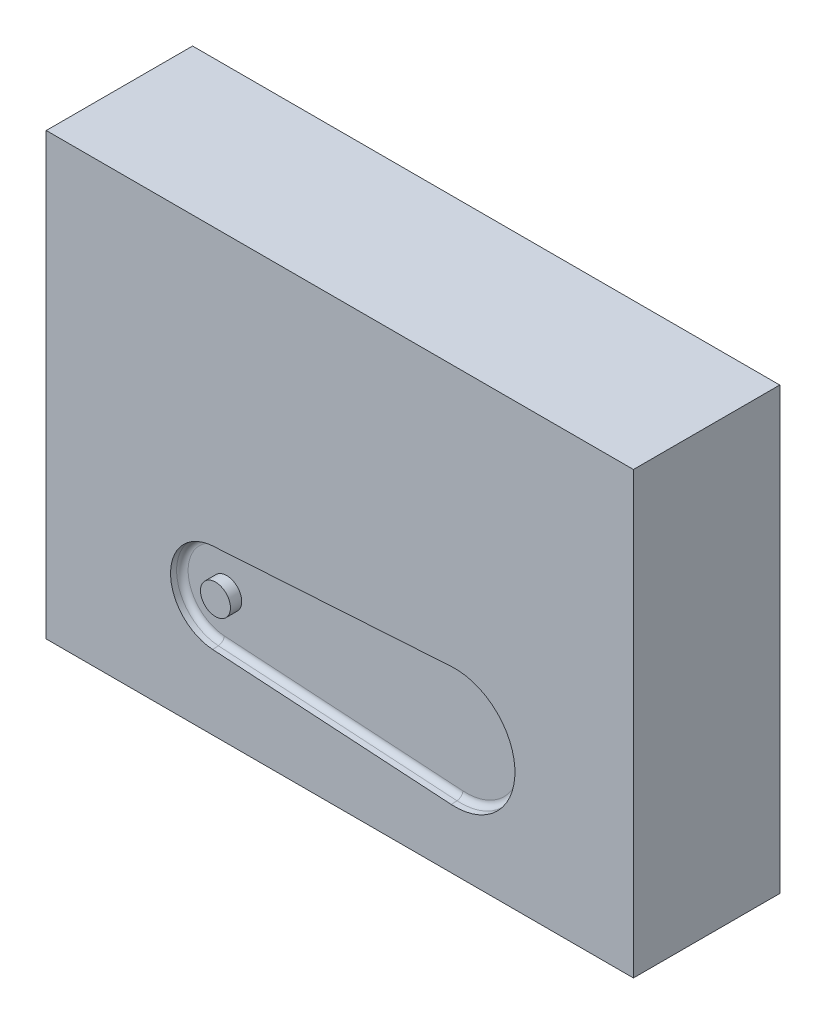
ISO-10303-21;
HEADER;
FILE_DESCRIPTION(('STEP AP214'),'2;1');
FILE_NAME('part.step','',(''),(''),'','','');
FILE_SCHEMA(('AUTOMOTIVE_DESIGN { 1 0 10303 214 1 1 1 1 }'));
ENDSEC;
DATA;
#1=APPLICATION_CONTEXT('core data for automotive mechanical design processes');
#2=APPLICATION_PROTOCOL_DEFINITION('international standard','automotive_design',2000,#1);
#3=PRODUCT_CONTEXT('',#1,'mechanical');
#4=PRODUCT('Part','Part','',(#3));
#5=PRODUCT_RELATED_PRODUCT_CATEGORY('part','',(#4));
#6=PRODUCT_DEFINITION_FORMATION('','',#4);
#7=PRODUCT_DEFINITION_CONTEXT('part definition',#1,'design');
#8=PRODUCT_DEFINITION('design','',#6,#7);
#9=PRODUCT_DEFINITION_SHAPE('','',#8);
#10=(LENGTH_UNIT() NAMED_UNIT(*) SI_UNIT(.MILLI.,.METRE.));
#11=(NAMED_UNIT(*) PLANE_ANGLE_UNIT() SI_UNIT($,.RADIAN.));
#12=(NAMED_UNIT(*) SI_UNIT($,.STERADIAN.) SOLID_ANGLE_UNIT());
#13=UNCERTAINTY_MEASURE_WITH_UNIT(LENGTH_MEASURE(1.E-05),#10,'distance_accuracy_value','');
#14=(GEOMETRIC_REPRESENTATION_CONTEXT(3) GLOBAL_UNCERTAINTY_ASSIGNED_CONTEXT((#13)) GLOBAL_UNIT_ASSIGNED_CONTEXT((#10,
#11,#12)) REPRESENTATION_CONTEXT('',''));
#15=CARTESIAN_POINT('',(0.,0.,0.));
#16=DIRECTION('',(0.,0.,1.));
#17=DIRECTION('',(1.,0.,0.));
#18=AXIS2_PLACEMENT_3D('',#15,#16,#17);
#19=CARTESIAN_POINT('',(-79.9352750809062,56.6343042071197,100.));
#20=DIRECTION('',(1.,0.,0.));
#21=DIRECTION('',(0.,0.,-1.));
#22=AXIS2_PLACEMENT_3D('',#19,#20,#21);
#23=PLANE('',#22);
#24=DIRECTION('',(0.,-1.,0.));
#25=VECTOR('',#24,1.);
#26=CARTESIAN_POINT('',(-79.9352750809062,56.6343042071197,49.8415382280655));
#27=LINE('',#26,#25);
#28=CARTESIAN_POINT('',(-79.9352750809062,56.6343042071197,49.8415382280655));
#29=VERTEX_POINT('',#28);
#30=CARTESIAN_POINT('',(-79.9352750809062,-93.3656957928802,49.8415382280655));
#31=VERTEX_POINT('',#30);
#32=EDGE_CURVE('E128',#29,#31,#27,.T.);
#33=ORIENTED_EDGE('',*,*,#32,.F.);
#34=DIRECTION('',(0.,0.,-1.));
#35=VECTOR('',#34,1.);
#36=CARTESIAN_POINT('',(-79.9352750809062,56.6343042071197,100.));
#37=LINE('',#36,#35);
#38=CARTESIAN_POINT('',(-79.9352750809062,56.6343042071197,0.));
#39=VERTEX_POINT('',#38);
#40=EDGE_CURVE('E114',#29,#39,#37,.T.);
#41=ORIENTED_EDGE('',*,*,#40,.T.);
#42=DIRECTION('',(0.,-1.,0.));
#43=VECTOR('',#42,1.);
#44=CARTESIAN_POINT('',(-79.9352750809062,56.6343042071197,0.));
#45=LINE('',#44,#43);
#46=CARTESIAN_POINT('',(-79.9352750809062,-93.3656957928802,0.));
#47=VERTEX_POINT('',#46);
#48=EDGE_CURVE('E204',#39,#47,#45,.T.);
#49=ORIENTED_EDGE('',*,*,#48,.T.);
#50=DIRECTION('',(0.,0.,-1.));
#51=VECTOR('',#50,1.);
#52=CARTESIAN_POINT('',(-79.9352750809062,-93.3656957928802,100.));
#53=LINE('',#52,#51);
#54=EDGE_CURVE('E11',#31,#47,#53,.T.);
#55=ORIENTED_EDGE('',*,*,#54,.F.);
#56=EDGE_LOOP('',(#33,#41,#49,#55));
#57=FACE_BOUND('',#56,.T.);
#58=ADVANCED_FACE('F38',(#57),#23,.F.);
#59=CARTESIAN_POINT('',(-79.9352750809062,-93.3656957928802,100.));
#60=DIRECTION('',(0.,1.,0.));
#61=DIRECTION('',(0.,0.,1.));
#62=AXIS2_PLACEMENT_3D('',#59,#60,#61);
#63=PLANE('',#62);
#64=DIRECTION('',(1.,0.,0.));
#65=VECTOR('',#64,1.);
#66=CARTESIAN_POINT('',(-79.9352750809062,-93.3656957928802,49.8415382280655));
#67=LINE('',#66,#65);
#68=CARTESIAN_POINT('',(120.064724919094,-93.3656957928802,49.8415382280655));
#69=VERTEX_POINT('',#68);
#70=EDGE_CURVE('E52',#31,#69,#67,.T.);
#71=ORIENTED_EDGE('',*,*,#70,.F.);
#72=ORIENTED_EDGE('',*,*,#54,.T.);
#73=DIRECTION('',(1.,0.,0.));
#74=VECTOR('',#73,1.);
#75=CARTESIAN_POINT('',(-79.9352750809062,-93.3656957928802,0.));
#76=LINE('',#75,#74);
#77=CARTESIAN_POINT('',(120.064724919094,-93.3656957928802,0.));
#78=VERTEX_POINT('',#77);
#79=EDGE_CURVE('E219',#47,#78,#76,.T.);
#80=ORIENTED_EDGE('',*,*,#79,.T.);
#81=DIRECTION('',(0.,0.,-1.));
#82=VECTOR('',#81,1.);
#83=CARTESIAN_POINT('',(120.064724919094,-93.3656957928802,100.));
#84=LINE('',#83,#82);
#85=EDGE_CURVE('E46',#69,#78,#84,.T.);
#86=ORIENTED_EDGE('',*,*,#85,.F.);
#87=EDGE_LOOP('',(#71,#72,#80,#86));
#88=FACE_BOUND('',#87,.T.);
#89=ADVANCED_FACE('F234',(#88),#63,.F.);
#90=CARTESIAN_POINT('',(120.064724919094,56.6343042071197,100.));
#91=DIRECTION('',(-1.,0.,0.));
#92=DIRECTION('',(0.,-1.,0.));
#93=AXIS2_PLACEMENT_3D('',#90,#91,#92);
#94=PLANE('',#93);
#95=DIRECTION('',(0.,1.,0.));
#96=VECTOR('',#95,1.);
#97=CARTESIAN_POINT('',(120.064724919094,56.6343042071197,49.8415382280655));
#98=LINE('',#97,#96);
#99=CARTESIAN_POINT('',(120.064724919094,56.6343042071197,49.8415382280655));
#100=VERTEX_POINT('',#99);
#101=EDGE_CURVE('E60',#69,#100,#98,.T.);
#102=ORIENTED_EDGE('',*,*,#101,.F.);
#103=ORIENTED_EDGE('',*,*,#85,.T.);
#104=DIRECTION('',(0.,1.,0.));
#105=VECTOR('',#104,1.);
#106=CARTESIAN_POINT('',(120.064724919094,56.6343042071197,0.));
#107=LINE('',#106,#105);
#108=CARTESIAN_POINT('',(120.064724919094,56.6343042071197,0.));
#109=VERTEX_POINT('',#108);
#110=EDGE_CURVE('E223',#78,#109,#107,.T.);
#111=ORIENTED_EDGE('',*,*,#110,.T.);
#112=DIRECTION('',(0.,0.,-1.));
#113=VECTOR('',#112,1.);
#114=CARTESIAN_POINT('',(120.064724919094,56.6343042071197,100.));
#115=LINE('',#114,#113);
#116=EDGE_CURVE('E125',#100,#109,#115,.T.);
#117=ORIENTED_EDGE('',*,*,#116,.F.);
#118=EDGE_LOOP('',(#102,#103,#111,#117));
#119=FACE_BOUND('',#118,.T.);
#120=ADVANCED_FACE('F231',(#119),#94,.F.);
#121=CARTESIAN_POINT('',(-79.9352750809062,56.6343042071197,100.));
#122=DIRECTION('',(0.,-1.,0.));
#123=DIRECTION('',(0.,0.,-1.));
#124=AXIS2_PLACEMENT_3D('',#121,#122,#123);
#125=PLANE('',#124);
#126=DIRECTION('',(-1.,0.,0.));
#127=VECTOR('',#126,1.);
#128=CARTESIAN_POINT('',(-79.9352750809062,56.6343042071197,49.8415382280655));
#129=LINE('',#128,#127);
#130=EDGE_CURVE('E118',#100,#29,#129,.T.);
#131=ORIENTED_EDGE('',*,*,#130,.F.);
#132=ORIENTED_EDGE('',*,*,#116,.T.);
#133=DIRECTION('',(-1.,0.,0.));
#134=VECTOR('',#133,1.);
#135=CARTESIAN_POINT('',(-79.9352750809062,56.6343042071197,0.));
#136=LINE('',#135,#134);
#137=EDGE_CURVE('E120',#109,#39,#136,.T.);
#138=ORIENTED_EDGE('',*,*,#137,.T.);
#139=ORIENTED_EDGE('',*,*,#40,.F.);
#140=EDGE_LOOP('',(#131,#132,#138,#139));
#141=FACE_BOUND('',#140,.T.);
#142=ADVANCED_FACE('F116',(#141),#125,.F.);
#143=CARTESIAN_POINT('',(0.,0.,0.));
#144=DIRECTION('',(0.,0.,1.));
#145=DIRECTION('',(1.,0.,0.));
#146=AXIS2_PLACEMENT_3D('',#143,#144,#145);
#147=PLANE('',#146);
#148=ORIENTED_EDGE('',*,*,#48,.F.);
#149=ORIENTED_EDGE('',*,*,#137,.F.);
#150=ORIENTED_EDGE('',*,*,#110,.F.);
#151=ORIENTED_EDGE('',*,*,#79,.F.);
#152=EDGE_LOOP('',(#148,#149,#150,#151));
#153=FACE_BOUND('',#152,.T.);
#154=ADVANCED_FACE('F236',(#153),#147,.F.);
#155=CARTESIAN_POINT('',(-22.2948723539945,-52.8416048933411,46.0165382280654));
#156=DIRECTION('',(0.,0.,1.));
#157=DIRECTION('',(1.,0.,0.));
#158=AXIS2_PLACEMENT_3D('',#155,#156,#157);
#159=CYLINDRICAL_SURFACE('',#158,5.1);
#160=CARTESIAN_POINT('',(-22.2948723539945,-52.8416048933411,46.0165382280654));
#161=DIRECTION('',(0.,0.,1.));
#162=DIRECTION('',(1.,0.,0.));
#163=AXIS2_PLACEMENT_3D('',#160,#161,#162);
#164=CIRCLE('',#163,5.1);
#165=CARTESIAN_POINT('',(-17.1948723539945,-52.8416048933411,46.0165382280654));
#166=VERTEX_POINT('',#165);
#167=EDGE_CURVE('E145',#166,#166,#164,.T.);
#168=ORIENTED_EDGE('',*,*,#167,.T.);
#169=EDGE_LOOP('',(#168));
#170=FACE_BOUND('',#169,.T.);
#171=CARTESIAN_POINT('',(-22.2948723539945,-52.8416048933411,49.8415382280655));
#172=DIRECTION('',(0.,0.,1.));
#173=DIRECTION('',(1.,0.,0.));
#174=AXIS2_PLACEMENT_3D('',#171,#172,#173);
#175=CIRCLE('',#174,5.1);
#176=CARTESIAN_POINT('',(-17.1948723539945,-52.8416048933411,49.8415382280655));
#177=VERTEX_POINT('',#176);
#178=EDGE_CURVE('E135',#177,#177,#175,.F.);
#179=ORIENTED_EDGE('',*,*,#178,.T.);
#180=EDGE_LOOP('',(#179));
#181=FACE_BOUND('',#180,.T.);
#182=ADVANCED_FACE('F238',(#170,#181),#159,.T.);
#183=CARTESIAN_POINT('',(59.3051276460055,-52.8416048933411,49.8415382280655));
#184=DIRECTION('',(0.,0.,1.));
#185=DIRECTION('',(1.,0.,0.));
#186=AXIS2_PLACEMENT_3D('',#183,#184,#185);
#187=CONICAL_SURFACE('',#186,20.4,0.0698131700797733);
#188=DIRECTION('',(-0.00435977960900784,-0.0696200973209298,0.997564050259824));
#189=VECTOR('',#188,1.);
#190=CARTESIAN_POINT('',(58.0301276460055,-73.201722157247,49.8415382280655));
#191=LINE('',#190,#189);
#192=CARTESIAN_POINT('',(58.0385507815602,-73.0672154689154,47.9142350216274));
#193=VERTEX_POINT('',#192);
#194=CARTESIAN_POINT('',(58.0301276460055,-73.201722157247,49.8415382280655));
#195=VERTEX_POINT('',#194);
#196=EDGE_CURVE('E166',#193,#195,#191,.T.);
#197=ORIENTED_EDGE('',*,*,#196,.T.);
#198=CARTESIAN_POINT('',(59.3051276460055,-52.8416048933411,49.8415382280655));
#199=DIRECTION('',(0.,0.,1.));
#200=DIRECTION('',(1.,0.,0.));
#201=AXIS2_PLACEMENT_3D('',#198,#199,#200);
#202=CIRCLE('',#201,20.4);
#203=CARTESIAN_POINT('',(58.0301276460055,-32.4814876294352,49.8415382280655));
#204=VERTEX_POINT('',#203);
#205=EDGE_CURVE('E149',#195,#204,#202,.T.);
#206=ORIENTED_EDGE('',*,*,#205,.T.);
#207=DIRECTION('',(-0.00435977960900784,0.0696200973209298,0.997564050259824));
#208=VECTOR('',#207,1.);
#209=CARTESIAN_POINT('',(58.0301276460055,-32.4814876294352,49.8415382280655));
#210=LINE('',#209,#208);
#211=CARTESIAN_POINT('',(58.0385507815602,-32.6159943177668,47.9142350216274));
#212=VERTEX_POINT('',#211);
#213=EDGE_CURVE('E165',#212,#204,#210,.T.);
#214=ORIENTED_EDGE('',*,*,#213,.F.);
#215=CARTESIAN_POINT('',(59.3051276460055,-52.8416048933411,47.9142350216274));
#216=DIRECTION('',(0.,0.,1.));
#217=DIRECTION('',(1.,0.,0.));
#218=AXIS2_PLACEMENT_3D('',#215,#216,#217);
#219=CIRCLE('',#218,20.2652298311253);
#220=EDGE_CURVE('E201',#193,#212,#219,.T.);
#221=ORIENTED_EDGE('',*,*,#220,.F.);
#222=EDGE_LOOP('',(#197,#206,#214,#221));
#223=FACE_BOUND('',#222,.T.);
#224=ADVANCED_FACE('F244',(#223),#187,.F.);
#225=CARTESIAN_POINT('',(-23.2511223539945,-68.1116928412706,49.8415382280655));
#226=DIRECTION('',(-0.062347753141239,-0.99561377654642,-0.0697564737441255));
#227=DIRECTION('',(0.,0.0698924504621114,-0.997554532528624));
#228=AXIS2_PLACEMENT_3D('',#225,#226,#227);
#229=PLANE('',#228);
#230=DIRECTION('',(-0.00435977960900785,-0.0696200973209298,0.997564050259824));
#231=VECTOR('',#230,1.);
#232=CARTESIAN_POINT('',(-23.2511223539945,-68.1116928412706,49.8415382280655));
#233=LINE('',#232,#231);
#234=CARTESIAN_POINT('',(-23.2426992184398,-67.9771861529389,47.9142350216274));
#235=VERTEX_POINT('',#234);
#236=CARTESIAN_POINT('',(-23.2511223539945,-68.1116928412706,49.8415382280655));
#237=VERTEX_POINT('',#236);
#238=EDGE_CURVE('E170',#235,#237,#233,.T.);
#239=ORIENTED_EDGE('',*,*,#238,.T.);
#240=DIRECTION('',(0.998044963916957,-0.0625,0.));
#241=VECTOR('',#240,1.);
#242=CARTESIAN_POINT('',(-23.2511223539945,-68.1116928412706,49.8415382280655));
#243=LINE('',#242,#241);
#244=EDGE_CURVE('E161',#237,#195,#243,.T.);
#245=ORIENTED_EDGE('',*,*,#244,.T.);
#246=ORIENTED_EDGE('',*,*,#196,.F.);
#247=DIRECTION('',(0.998044963916957,-0.0625,0.));
#248=VECTOR('',#247,1.);
#249=CARTESIAN_POINT('',(58.0385507815602,-73.0672154689154,47.9142350216274));
#250=LINE('',#249,#248);
#251=EDGE_CURVE('E169',#235,#193,#250,.T.);
#252=ORIENTED_EDGE('',*,*,#251,.F.);
#253=EDGE_LOOP('',(#239,#245,#246,#252));
#254=FACE_BOUND('',#253,.T.);
#255=ADVANCED_FACE('F279',(#254),#229,.F.);
#256=CARTESIAN_POINT('',(-22.2948723539945,-52.8416048933411,49.8415382280655));
#257=DIRECTION('',(0.,0.,1.));
#258=DIRECTION('',(1.,0.,0.));
#259=AXIS2_PLACEMENT_3D('',#256,#257,#258);
#260=CONICAL_SURFACE('',#259,15.3,0.0698131700797733);
#261=DIRECTION('',(-0.00435977960900785,0.0696200973209298,0.997564050259824));
#262=VECTOR('',#261,1.);
#263=CARTESIAN_POINT('',(-23.2511223539945,-37.5715169454117,49.8415382280655));
#264=LINE('',#263,#262);
#265=CARTESIAN_POINT('',(-23.2426992184398,-37.7060236337433,47.9142350216274));
#266=VERTEX_POINT('',#265);
#267=CARTESIAN_POINT('',(-23.2511223539945,-37.5715169454117,49.8415382280655));
#268=VERTEX_POINT('',#267);
#269=EDGE_CURVE('E173',#266,#268,#264,.T.);
#270=ORIENTED_EDGE('',*,*,#269,.T.);
#271=CARTESIAN_POINT('',(-22.2948723539945,-52.8416048933411,49.8415382280655));
#272=DIRECTION('',(0.,0.,1.));
#273=DIRECTION('',(1.,0.,0.));
#274=AXIS2_PLACEMENT_3D('',#271,#272,#273);
#275=CIRCLE('',#274,15.3);
#276=EDGE_CURVE('E157',#268,#237,#275,.T.);
#277=ORIENTED_EDGE('',*,*,#276,.T.);
#278=ORIENTED_EDGE('',*,*,#238,.F.);
#279=CARTESIAN_POINT('',(-22.2948723539945,-52.8416048933411,47.9142350216274));
#280=DIRECTION('',(0.,0.,1.));
#281=DIRECTION('',(1.,0.,0.));
#282=AXIS2_PLACEMENT_3D('',#279,#280,#281);
#283=CIRCLE('',#282,15.1652298311253);
#284=EDGE_CURVE('E195',#266,#235,#283,.T.);
#285=ORIENTED_EDGE('',*,*,#284,.F.);
#286=EDGE_LOOP('',(#270,#277,#278,#285));
#287=FACE_BOUND('',#286,.T.);
#288=ADVANCED_FACE('F291',(#287),#260,.F.);
#289=CARTESIAN_POINT('',(-23.2511223539945,-37.5715169454117,49.8415382280655));
#290=DIRECTION('',(-0.0623477531412391,0.99561377654642,-0.0697564737441255));
#291=DIRECTION('',(0.,0.0698924504621114,0.997554532528624));
#292=AXIS2_PLACEMENT_3D('',#289,#290,#291);
#293=PLANE('',#292);
#294=ORIENTED_EDGE('',*,*,#213,.T.);
#295=DIRECTION('',(-0.998044963916957,-0.0625000000000001,0.));
#296=VECTOR('',#295,1.);
#297=CARTESIAN_POINT('',(-23.2511223539945,-37.5715169454117,49.8415382280655));
#298=LINE('',#297,#296);
#299=EDGE_CURVE('E154',#204,#268,#298,.T.);
#300=ORIENTED_EDGE('',*,*,#299,.T.);
#301=ORIENTED_EDGE('',*,*,#269,.F.);
#302=DIRECTION('',(-0.998044963916957,-0.0625000000000001,0.));
#303=VECTOR('',#302,1.);
#304=CARTESIAN_POINT('',(-23.2426992184398,-37.7060236337433,47.9142350216274));
#305=LINE('',#304,#303);
#306=EDGE_CURVE('E198',#212,#266,#305,.T.);
#307=ORIENTED_EDGE('',*,*,#306,.F.);
#308=EDGE_LOOP('',(#294,#300,#301,#307));
#309=FACE_BOUND('',#308,.T.);
#310=ADVANCED_FACE('F302',(#309),#293,.F.);
#311=CARTESIAN_POINT('',(59.3051276460055,-52.8416048933411,46.0165382280654));
#312=DIRECTION('',(0.,0.,1.));
#313=DIRECTION('',(1.,0.,0.));
#314=AXIS2_PLACEMENT_3D('',#311,#312,#313);
#315=PLANE('',#314);
#316=CARTESIAN_POINT('',(59.3051276460055,-52.8416048933411,46.0165382280654));
#317=DIRECTION('',(0.,0.,1.));
#318=DIRECTION('',(1.,0.,0.));
#319=AXIS2_PLACEMENT_3D('',#316,#317,#318);
#320=CIRCLE('',#319,18.2301991685952);
#321=CARTESIAN_POINT('',(58.1657401979683,-34.6470464219215,46.0165382280654));
#322=VERTEX_POINT('',#321);
#323=CARTESIAN_POINT('',(58.1657401979683,-71.0361633647607,46.0165382280654));
#324=VERTEX_POINT('',#323);
#325=EDGE_CURVE('E182',#322,#324,#320,.F.);
#326=ORIENTED_EDGE('',*,*,#325,.F.);
#327=DIRECTION('',(-0.998044963916957,-0.0625000000000001,0.));
#328=VECTOR('',#327,1.);
#329=CARTESIAN_POINT('',(58.1657401979683,-34.6470464219215,46.0165382280654));
#330=LINE('',#329,#328);
#331=CARTESIAN_POINT('',(-23.1155098020317,-39.737075737898,46.0165382280654));
#332=VERTEX_POINT('',#331);
#333=EDGE_CURVE('E185',#332,#322,#330,.F.);
#334=ORIENTED_EDGE('',*,*,#333,.F.);
#335=CARTESIAN_POINT('',(-22.2948723539945,-52.8416048933411,46.0165382280654));
#336=DIRECTION('',(0.,0.,1.));
#337=DIRECTION('',(1.,0.,0.));
#338=AXIS2_PLACEMENT_3D('',#335,#336,#337);
#339=CIRCLE('',#338,13.1301991685952);
#340=CARTESIAN_POINT('',(-23.1155098020317,-65.9461340487842,46.0165382280654));
#341=VERTEX_POINT('',#340);
#342=EDGE_CURVE('E188',#341,#332,#339,.F.);
#343=ORIENTED_EDGE('',*,*,#342,.F.);
#344=DIRECTION('',(0.998044963916957,-0.0625,0.));
#345=VECTOR('',#344,1.);
#346=CARTESIAN_POINT('',(-23.1155098020317,-65.9461340487842,46.0165382280654));
#347=LINE('',#346,#345);
#348=EDGE_CURVE('E191',#324,#341,#347,.F.);
#349=ORIENTED_EDGE('',*,*,#348,.F.);
#350=EDGE_LOOP('',(#326,#334,#343,#349));
#351=FACE_BOUND('',#350,.T.);
#352=ORIENTED_EDGE('',*,*,#167,.F.);
#353=EDGE_LOOP('',(#352));
#354=FACE_BOUND('',#353,.T.);
#355=ADVANCED_FACE('F313',(#351,#354),#315,.T.);
#356=CARTESIAN_POINT('',(-25.6621679470013,23.6583951066589,49.8415382280655));
#357=DIRECTION('',(0.,0.,1.));
#358=DIRECTION('',(1.,0.,0.));
#359=AXIS2_PLACEMENT_3D('',#356,#357,#358);
#360=PLANE('',#359);
#361=ORIENTED_EDGE('',*,*,#276,.F.);
#362=ORIENTED_EDGE('',*,*,#299,.F.);
#363=ORIENTED_EDGE('',*,*,#205,.F.);
#364=ORIENTED_EDGE('',*,*,#244,.F.);
#365=EDGE_LOOP('',(#361,#362,#363,#364));
#366=FACE_BOUND('',#365,.T.);
#367=ORIENTED_EDGE('',*,*,#130,.T.);
#368=ORIENTED_EDGE('',*,*,#32,.T.);
#369=ORIENTED_EDGE('',*,*,#70,.T.);
#370=ORIENTED_EDGE('',*,*,#101,.T.);
#371=EDGE_LOOP('',(#367,#368,#369,#370));
#372=FACE_BOUND('',#371,.T.);
#373=ADVANCED_FACE('F133',(#366,#372),#360,.T.);
#374=CARTESIAN_POINT('',(-23.1155098020317,-39.737075737898,48.0565382280654));
#375=DIRECTION('',(0.998044963916957,0.0625000000000001,0.));
#376=DIRECTION('',(-0.0625000000000001,0.998044963916957,0.));
#377=AXIS2_PLACEMENT_3D('',#374,#375,#376);
#378=CYLINDRICAL_SURFACE('',#377,2.04);
#379=CARTESIAN_POINT('',(58.1657401979683,-34.6470464219215,48.0565382280654));
#380=DIRECTION('',(0.998044963916957,0.0624999999999987,0.));
#381=DIRECTION('',(-0.0624999999999987,0.998044963916957,0.));
#382=AXIS2_PLACEMENT_3D('',#379,#380,#381);
#383=CIRCLE('',#382,2.04);
#384=EDGE_CURVE('E210',#322,#212,#383,.T.);
#385=ORIENTED_EDGE('',*,*,#384,.T.);
#386=ORIENTED_EDGE('',*,*,#306,.T.);
#387=CARTESIAN_POINT('',(-23.1155098020317,-39.737075737898,48.0565382280654));
#388=DIRECTION('',(-0.998044963916957,-0.0624999999999987,0.));
#389=DIRECTION('',(0.0624999999999987,-0.998044963916957,0.));
#390=AXIS2_PLACEMENT_3D('',#387,#388,#389);
#391=CIRCLE('',#390,2.04);
#392=EDGE_CURVE('E150',#266,#332,#391,.T.);
#393=ORIENTED_EDGE('',*,*,#392,.T.);
#394=ORIENTED_EDGE('',*,*,#333,.T.);
#395=EDGE_LOOP('',(#385,#386,#393,#394));
#396=FACE_BOUND('',#395,.T.);
#397=ADVANCED_FACE('F325',(#396),#378,.F.);
#398=CARTESIAN_POINT('',(-22.2948723539945,-52.8416048933411,48.0565382280654));
#399=DIRECTION('',(0.,0.,1.));
#400=DIRECTION('',(1.,0.,0.));
#401=AXIS2_PLACEMENT_3D('',#398,#399,#400);
#402=TOROIDAL_SURFACE('',#401,13.1301991685952,2.04);
#403=ORIENTED_EDGE('',*,*,#392,.F.);
#404=ORIENTED_EDGE('',*,*,#284,.T.);
#405=CARTESIAN_POINT('',(-23.1155098020317,-65.9461340487842,48.0565382280654));
#406=DIRECTION('',(0.998044963916957,-0.0624999999999986,0.));
#407=DIRECTION('',(0.0624999999999986,0.998044963916957,0.));
#408=AXIS2_PLACEMENT_3D('',#405,#406,#407);
#409=CIRCLE('',#408,2.04);
#410=EDGE_CURVE('E207',#235,#341,#409,.T.);
#411=ORIENTED_EDGE('',*,*,#410,.T.);
#412=ORIENTED_EDGE('',*,*,#342,.T.);
#413=EDGE_LOOP('',(#403,#404,#411,#412));
#414=FACE_BOUND('',#413,.T.);
#415=ADVANCED_FACE('F356',(#414),#402,.F.);
#416=CARTESIAN_POINT('',(59.3051276460055,-52.8416048933411,48.0565382280654));
#417=DIRECTION('',(0.,0.,1.));
#418=DIRECTION('',(1.,0.,0.));
#419=AXIS2_PLACEMENT_3D('',#416,#417,#418);
#420=TOROIDAL_SURFACE('',#419,18.2301991685952,2.04);
#421=ORIENTED_EDGE('',*,*,#384,.F.);
#422=ORIENTED_EDGE('',*,*,#325,.T.);
#423=CARTESIAN_POINT('',(58.1657401979683,-71.0361633647607,48.0565382280654));
#424=DIRECTION('',(-0.998044963916957,0.0624999999999986,0.));
#425=DIRECTION('',(-0.0624999999999986,-0.998044963916957,0.));
#426=AXIS2_PLACEMENT_3D('',#423,#424,#425);
#427=CIRCLE('',#426,2.04);
#428=EDGE_CURVE('E131',#324,#193,#427,.T.);
#429=ORIENTED_EDGE('',*,*,#428,.T.);
#430=ORIENTED_EDGE('',*,*,#220,.T.);
#431=EDGE_LOOP('',(#421,#422,#429,#430));
#432=FACE_BOUND('',#431,.T.);
#433=ADVANCED_FACE('F347',(#432),#420,.F.);
#434=CARTESIAN_POINT('',(-23.1155098020317,-65.9461340487842,48.0565382280654));
#435=DIRECTION('',(-0.998044963916957,0.0625,0.));
#436=DIRECTION('',(-0.0625,-0.998044963916957,0.));
#437=AXIS2_PLACEMENT_3D('',#434,#435,#436);
#438=CYLINDRICAL_SURFACE('',#437,2.04);
#439=ORIENTED_EDGE('',*,*,#410,.F.);
#440=ORIENTED_EDGE('',*,*,#251,.T.);
#441=ORIENTED_EDGE('',*,*,#428,.F.);
#442=ORIENTED_EDGE('',*,*,#348,.T.);
#443=EDGE_LOOP('',(#439,#440,#441,#442));
#444=FACE_BOUND('',#443,.T.);
#445=ADVANCED_FACE('F338',(#444),#438,.F.);
#446=CARTESIAN_POINT('',(706.491894297039,-116.186538011192,49.8415382280655));
#447=DIRECTION('',(0.,0.,1.));
#448=DIRECTION('',(1.,0.,0.));
#449=AXIS2_PLACEMENT_3D('',#446,#447,#448);
#450=PLANE('',#449);
#451=ORIENTED_EDGE('',*,*,#178,.F.);
#452=EDGE_LOOP('',(#451));
#453=FACE_BOUND('',#452,.T.);
#454=ADVANCED_FACE('F335',(#453),#450,.T.);
#455=CLOSED_SHELL('',(#58,#89,#120,#142,#154,#182,#224,#255,#288,#310,#355,#373,#397,#415,#433,
#445,#454));
#456=MANIFOLD_SOLID_BREP('B2',#455);
#457=ADVANCED_BREP_SHAPE_REPRESENTATION('',(#18,#456),#14);
#458=SHAPE_DEFINITION_REPRESENTATION(#9,#457);
ENDSEC;
END-ISO-10303-21;
